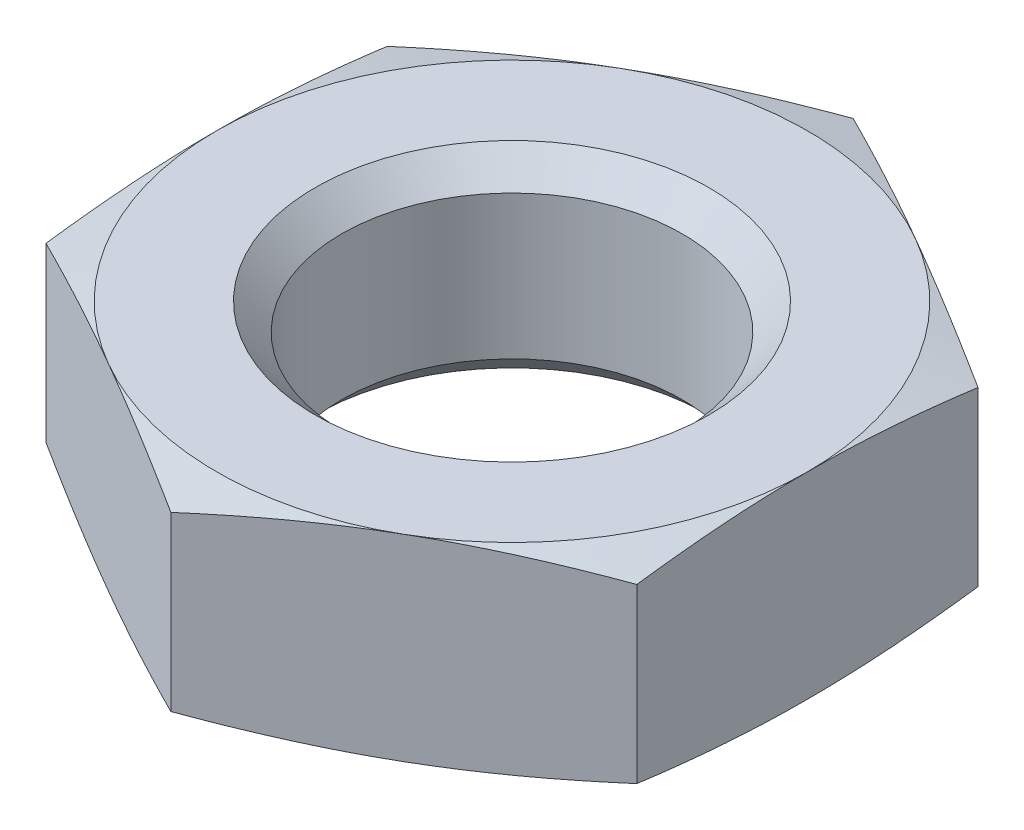
ISO-10303-21;
HEADER;
FILE_DESCRIPTION(('STEP AP214'),'2;1');
FILE_NAME('part.step','',(''),(''),'','','');
FILE_SCHEMA(('AUTOMOTIVE_DESIGN { 1 0 10303 214 1 1 1 1 }'));
ENDSEC;
DATA;
#1=APPLICATION_CONTEXT('core data for automotive mechanical design processes');
#2=APPLICATION_PROTOCOL_DEFINITION('international standard','automotive_design',2000,#1);
#3=PRODUCT_CONTEXT('',#1,'mechanical');
#4=PRODUCT('Part','Part','',(#3));
#5=PRODUCT_RELATED_PRODUCT_CATEGORY('part','',(#4));
#6=PRODUCT_DEFINITION_FORMATION('','',#4);
#7=PRODUCT_DEFINITION_CONTEXT('part definition',#1,'design');
#8=PRODUCT_DEFINITION('design','',#6,#7);
#9=PRODUCT_DEFINITION_SHAPE('','',#8);
#10=(LENGTH_UNIT() NAMED_UNIT(*) SI_UNIT(.MILLI.,.METRE.));
#11=(NAMED_UNIT(*) PLANE_ANGLE_UNIT() SI_UNIT($,.RADIAN.));
#12=(NAMED_UNIT(*) SI_UNIT($,.STERADIAN.) SOLID_ANGLE_UNIT());
#13=UNCERTAINTY_MEASURE_WITH_UNIT(LENGTH_MEASURE(1.E-05),#10,'distance_accuracy_value','');
#14=(GEOMETRIC_REPRESENTATION_CONTEXT(3) GLOBAL_UNCERTAINTY_ASSIGNED_CONTEXT((#13)) GLOBAL_UNIT_ASSIGNED_CONTEXT((#10,
#11,#12)) REPRESENTATION_CONTEXT('',''));
#15=CARTESIAN_POINT('',(0.,0.,0.));
#16=DIRECTION('',(0.,0.,1.));
#17=DIRECTION('',(1.,0.,0.));
#18=AXIS2_PLACEMENT_3D('',#15,#16,#17);
#19=CARTESIAN_POINT('',(0.,9.,0.));
#20=DIRECTION('',(0.,1.,0.));
#21=DIRECTION('',(-1.,0.,0.));
#22=AXIS2_PLACEMENT_3D('',#19,#20,#21);
#23=CONICAL_SURFACE('',#22,12.,1.30899693899575);
#24=CARTESIAN_POINT('',(5.99999999999998,9.,10.3923048454133));
#25=CARTESIAN_POINT('',(7.46976163509305,9.,9.5437375697477));
#26=CARTESIAN_POINT('',(9.,9.13129403163618,8.66025403784439));
#27=CARTESIAN_POINT('',(10.4219430908075,9.25329635848326,7.83929481159437));
#28=CARTESIAN_POINT('',(12.,9.49742261192844,6.92820323027551));
#29=B_SPLINE_CURVE_WITH_KNOTS('',2,(#24,#25,#26,#27,#28),.UNSPECIFIED.,.F.,.F.,(3,2,3),(0.,0.5,
1.),.UNSPECIFIED.);
#30=CARTESIAN_POINT('',(6.,9.,10.3923048454133));
#31=VERTEX_POINT('',#30);
#32=CARTESIAN_POINT('',(12.,9.49742261192856,6.92820323027551));
#33=VERTEX_POINT('',#32);
#34=EDGE_CURVE('E311',#31,#33,#29,.T.);
#35=ORIENTED_EDGE('',*,*,#34,.F.);
#36=CARTESIAN_POINT('',(0.,9.,0.));
#37=DIRECTION('',(0.,-1.,0.));
#38=DIRECTION('',(1.,0.,0.));
#39=AXIS2_PLACEMENT_3D('',#36,#37,#38);
#40=CIRCLE('',#39,12.);
#41=CARTESIAN_POINT('',(12.,9.,0.));
#42=VERTEX_POINT('',#41);
#43=EDGE_CURVE('E459',#42,#31,#40,.T.);
#44=ORIENTED_EDGE('',*,*,#43,.F.);
#45=CARTESIAN_POINT('',(12.,9.49742261192856,6.92820323027551));
#46=CARTESIAN_POINT('',(12.,9.25362781997351,5.10849412988159));
#47=CARTESIAN_POINT('',(12.,9.13154942779809,3.46753667956727));
#48=CARTESIAN_POINT('',(12.,9.,1.69927114311039));
#49=CARTESIAN_POINT('',(12.,9.,0.));
#50=B_SPLINE_CURVE_WITH_KNOTS('',2,(#45,#46,#47,#48,#49),.UNSPECIFIED.,.F.,.F.,(3,2,3),(0.,0.5,
1.),.UNSPECIFIED.);
#51=EDGE_CURVE('E629',#33,#42,#50,.T.);
#52=ORIENTED_EDGE('',*,*,#51,.F.);
#53=EDGE_LOOP('',(#35,#44,#52));
#54=FACE_BOUND('',#53,.T.);
#55=ADVANCED_FACE('F16',(#54),#23,.T.);
#56=CARTESIAN_POINT('',(0.,16.3569219381653,0.));
#57=DIRECTION('',(0.,-1.,0.));
#58=DIRECTION('',(1.,0.,0.));
#59=AXIS2_PLACEMENT_3D('',#56,#57,#58);
#60=CONICAL_SURFACE('',#59,14.4,1.30899693899575);
#61=CARTESIAN_POINT('',(0.,16.5025773880716,13.856406460551));
#62=CARTESIAN_POINT('',(-1.57753623074291,16.7466230922803,12.9456154930752));
#63=CARTESIAN_POINT('',(-2.99999999999999,16.8687059683638,12.1243556529821));
#64=CARTESIAN_POINT('',(-4.52978869038396,17.,11.2411317407857));
#65=CARTESIAN_POINT('',(-5.99999999999998,17.,10.3923048454133));
#66=B_SPLINE_CURVE_WITH_KNOTS('',2,(#61,#62,#63,#64,#65),.UNSPECIFIED.,.F.,.F.,(3,2,3),(0.,0.5,
1.),.UNSPECIFIED.);
#67=CARTESIAN_POINT('',(0.,16.5025773880715,13.856406460551));
#68=VERTEX_POINT('',#67);
#69=CARTESIAN_POINT('',(-6.,17.,10.3923048454133));
#70=VERTEX_POINT('',#69);
#71=EDGE_CURVE('E482',#68,#70,#66,.T.);
#72=ORIENTED_EDGE('',*,*,#71,.F.);
#73=CARTESIAN_POINT('',(5.99999999999998,17.,10.3923048454133));
#74=CARTESIAN_POINT('',(4.53023836506962,17.,11.2408721209849));
#75=CARTESIAN_POINT('',(3.,16.8687059683638,12.1243556529821));
#76=CARTESIAN_POINT('',(1.5780569093807,16.7467036415458,12.9453148791235));
#77=CARTESIAN_POINT('',(0.,16.5025773880716,13.856406460551));
#78=B_SPLINE_CURVE_WITH_KNOTS('',2,(#73,#74,#75,#76,#77),.UNSPECIFIED.,.F.,.F.,(3,2,3),(0.,0.5,
1.),.UNSPECIFIED.);
#79=CARTESIAN_POINT('',(6.,17.,10.3923048454133));
#80=VERTEX_POINT('',#79);
#81=EDGE_CURVE('E476',#80,#68,#78,.T.);
#82=ORIENTED_EDGE('',*,*,#81,.F.);
#83=CARTESIAN_POINT('',(0.,17.,0.));
#84=DIRECTION('',(0.,-1.,0.));
#85=DIRECTION('',(1.,0.,0.));
#86=AXIS2_PLACEMENT_3D('',#83,#84,#85);
#87=CIRCLE('',#86,12.);
#88=EDGE_CURVE('E358',#80,#70,#87,.T.);
#89=ORIENTED_EDGE('',*,*,#88,.T.);
#90=EDGE_LOOP('',(#72,#82,#89));
#91=FACE_BOUND('',#90,.T.);
#92=ADVANCED_FACE('F365',(#91),#60,.T.);
#93=CARTESIAN_POINT('',(0.,9.,0.));
#94=DIRECTION('',(0.,1.,0.));
#95=DIRECTION('',(-1.,0.,0.));
#96=AXIS2_PLACEMENT_3D('',#93,#94,#95);
#97=CONICAL_SURFACE('',#96,12.,1.30899693899575);
#98=CARTESIAN_POINT('',(12.,9.,0.));
#99=CARTESIAN_POINT('',(12.,9.,-1.69669351184597));
#100=CARTESIAN_POINT('',(12.,9.13122445860656,-3.46316531665232));
#101=CARTESIAN_POINT('',(12.,9.25322794160273,-5.10550939708846));
#102=CARTESIAN_POINT('',(12.,9.49742261192856,-6.92820323027551));
#103=B_SPLINE_CURVE_WITH_KNOTS('',2,(#98,#99,#100,#101,#102),.UNSPECIFIED.,.F.,.F.,(3,2,3),(0.,
0.5,1.),.UNSPECIFIED.);
#104=CARTESIAN_POINT('',(12.,9.49742261192856,-6.92820323027551));
#105=VERTEX_POINT('',#104);
#106=EDGE_CURVE('E124',#42,#105,#103,.T.);
#107=ORIENTED_EDGE('',*,*,#106,.F.);
#108=CARTESIAN_POINT('',(0.,9.,0.));
#109=DIRECTION('',(0.,-1.,0.));
#110=DIRECTION('',(1.,0.,0.));
#111=AXIS2_PLACEMENT_3D('',#108,#109,#110);
#112=CIRCLE('',#111,12.);
#113=CARTESIAN_POINT('',(6.,9.,-10.3923048454133));
#114=VERTEX_POINT('',#113);
#115=EDGE_CURVE('E528',#114,#42,#112,.T.);
#116=ORIENTED_EDGE('',*,*,#115,.F.);
#117=CARTESIAN_POINT('',(12.,9.49742261192844,-6.9282032302755));
#118=CARTESIAN_POINT('',(10.4224637691741,9.2533769077069,-7.83899419779923));
#119=CARTESIAN_POINT('',(8.99999999999998,9.13129403163618,-8.66025403784438));
#120=CARTESIAN_POINT('',(7.47021130954455,9.,-9.54347795008207));
#121=CARTESIAN_POINT('',(5.99999999999998,9.,-10.3923048454133));
#122=B_SPLINE_CURVE_WITH_KNOTS('',2,(#117,#118,#119,#120,#121),.UNSPECIFIED.,.F.,.F.,(3,2,3),
(0.,0.5,1.),.UNSPECIFIED.);
#123=EDGE_CURVE('E501',#105,#114,#122,.T.);
#124=ORIENTED_EDGE('',*,*,#123,.F.);
#125=EDGE_LOOP('',(#107,#116,#124));
#126=FACE_BOUND('',#125,.T.);
#127=ADVANCED_FACE('F373',(#126),#97,.T.);
#128=CARTESIAN_POINT('',(0.,16.3569219381653,0.));
#129=DIRECTION('',(0.,-1.,0.));
#130=DIRECTION('',(1.,0.,0.));
#131=AXIS2_PLACEMENT_3D('',#128,#129,#130);
#132=CONICAL_SURFACE('',#131,14.4,1.30899693899575);
#133=CARTESIAN_POINT('',(-5.99999999999998,17.,10.3923048454133));
#134=CARTESIAN_POINT('',(-7.46976163511963,17.,9.54373756973234));
#135=CARTESIAN_POINT('',(-9.,16.8687059683638,8.66025403784437));
#136=CARTESIAN_POINT('',(-10.4219430908384,16.746703641512,7.83929481157651));
#137=CARTESIAN_POINT('',(-12.,16.5025773880716,6.9282032302755));
#138=B_SPLINE_CURVE_WITH_KNOTS('',2,(#133,#134,#135,#136,#137),.UNSPECIFIED.,.F.,.F.,(3,2,3),
(0.,0.5,1.),.UNSPECIFIED.);
#139=CARTESIAN_POINT('',(-12.,16.5025773880715,6.92820323027551));
#140=VERTEX_POINT('',#139);
#141=EDGE_CURVE('E488',#70,#140,#138,.T.);
#142=ORIENTED_EDGE('',*,*,#141,.F.);
#143=CARTESIAN_POINT('',(0.,17.,0.));
#144=DIRECTION('',(0.,-1.,0.));
#145=DIRECTION('',(1.,0.,0.));
#146=AXIS2_PLACEMENT_3D('',#143,#144,#145);
#147=CIRCLE('',#146,12.);
#148=CARTESIAN_POINT('',(-12.,17.,0.));
#149=VERTEX_POINT('',#148);
#150=EDGE_CURVE('E573',#70,#149,#147,.T.);
#151=ORIENTED_EDGE('',*,*,#150,.T.);
#152=CARTESIAN_POINT('',(-12.,16.5025773880714,6.92820323027551));
#153=CARTESIAN_POINT('',(-12.,16.7463721800323,5.10849412983784));
#154=CARTESIAN_POINT('',(-12.,16.8684505722019,3.46753667956726));
#155=CARTESIAN_POINT('',(-12.,17.,1.69927114307261));
#156=CARTESIAN_POINT('',(-12.,17.,0.));
#157=B_SPLINE_CURVE_WITH_KNOTS('',2,(#152,#153,#154,#155,#156),.UNSPECIFIED.,.F.,.F.,(3,2,3),
(0.,0.5,1.),.UNSPECIFIED.);
#158=EDGE_CURVE('E578',#140,#149,#157,.T.);
#159=ORIENTED_EDGE('',*,*,#158,.F.);
#160=EDGE_LOOP('',(#142,#151,#159));
#161=FACE_BOUND('',#160,.T.);
#162=ADVANCED_FACE('F211',(#161),#132,.T.);
#163=CARTESIAN_POINT('',(0.,16.3569219381653,0.));
#164=DIRECTION('',(0.,-1.,0.));
#165=DIRECTION('',(1.,0.,0.));
#166=AXIS2_PLACEMENT_3D('',#163,#164,#165);
#167=CONICAL_SURFACE('',#166,14.4,1.30899693899575);
#168=CARTESIAN_POINT('',(12.,17.,0.));
#169=CARTESIAN_POINT('',(12.,17.,1.69875122165052));
#170=CARTESIAN_POINT('',(12.,16.8684505722019,3.46753667956727));
#171=CARTESIAN_POINT('',(12.,16.7464528411162,5.10789206731201));
#172=CARTESIAN_POINT('',(12.,16.5025773880714,6.92820323027551));
#173=B_SPLINE_CURVE_WITH_KNOTS('',2,(#168,#169,#170,#171,#172),.UNSPECIFIED.,.F.,.F.,(3,2,3),
(0.,0.5,1.),.UNSPECIFIED.);
#174=CARTESIAN_POINT('',(12.,17.,0.));
#175=VERTEX_POINT('',#174);
#176=CARTESIAN_POINT('',(12.,16.5025773880715,6.92820323027551));
#177=VERTEX_POINT('',#176);
#178=EDGE_CURVE('E193',#175,#177,#173,.T.);
#179=ORIENTED_EDGE('',*,*,#178,.F.);
#180=CARTESIAN_POINT('',(0.,17.,0.));
#181=DIRECTION('',(0.,-1.,0.));
#182=DIRECTION('',(1.,0.,0.));
#183=AXIS2_PLACEMENT_3D('',#180,#181,#182);
#184=CIRCLE('',#183,12.);
#185=EDGE_CURVE('E198',#175,#80,#184,.T.);
#186=ORIENTED_EDGE('',*,*,#185,.T.);
#187=CARTESIAN_POINT('',(12.,16.5025773880716,6.92820323027551));
#188=CARTESIAN_POINT('',(10.4224637693273,16.7466230922694,7.83899419771079));
#189=CARTESIAN_POINT('',(8.99999999999999,16.8687059683638,8.66025403784439));
#190=CARTESIAN_POINT('',(7.4702113096767,17.,9.54347795000579));
#191=CARTESIAN_POINT('',(5.99999999999998,17.,10.3923048454133));
#192=B_SPLINE_CURVE_WITH_KNOTS('',2,(#187,#188,#189,#190,#191),.UNSPECIFIED.,.F.,.F.,(3,2,3),
(0.,0.5,1.),.UNSPECIFIED.);
#193=EDGE_CURVE('E348',#177,#80,#192,.T.);
#194=ORIENTED_EDGE('',*,*,#193,.F.);
#195=EDGE_LOOP('',(#179,#186,#194));
#196=FACE_BOUND('',#195,.T.);
#197=ADVANCED_FACE('F200',(#196),#167,.T.);
#198=CARTESIAN_POINT('',(0.,17.,0.));
#199=DIRECTION('',(0.,1.,0.));
#200=DIRECTION('',(-1.,0.,0.));
#201=AXIS2_PLACEMENT_3D('',#198,#199,#200);
#202=CONICAL_SURFACE('',#201,8.,0.785398163397448);
#203=CARTESIAN_POINT('',(0.,15.9175,0.));
#204=DIRECTION('',(0.,-1.,0.));
#205=DIRECTION('',(1.,0.,0.));
#206=AXIS2_PLACEMENT_3D('',#203,#204,#205);
#207=CIRCLE('',#206,6.9175);
#208=CARTESIAN_POINT('',(6.9175,15.9175,0.));
#209=VERTEX_POINT('',#208);
#210=EDGE_CURVE('E27',#209,#209,#207,.T.);
#211=ORIENTED_EDGE('',*,*,#210,.T.);
#212=EDGE_LOOP('',(#211));
#213=FACE_BOUND('',#212,.T.);
#214=CARTESIAN_POINT('',(0.,17.,0.));
#215=DIRECTION('',(0.,-1.,0.));
#216=DIRECTION('',(1.,0.,0.));
#217=AXIS2_PLACEMENT_3D('',#214,#215,#216);
#218=CIRCLE('',#217,8.);
#219=CARTESIAN_POINT('',(8.,17.,0.));
#220=VERTEX_POINT('',#219);
#221=EDGE_CURVE('E574',#220,#220,#218,.T.);
#222=ORIENTED_EDGE('',*,*,#221,.F.);
#223=EDGE_LOOP('',(#222));
#224=FACE_BOUND('',#223,.T.);
#225=ADVANCED_FACE('F210',(#213,#224),#202,.F.);
#226=CARTESIAN_POINT('',(0.,10.0825,0.));
#227=DIRECTION('',(0.,-1.,0.));
#228=DIRECTION('',(1.,0.,0.));
#229=AXIS2_PLACEMENT_3D('',#226,#227,#228);
#230=CONICAL_SURFACE('',#229,6.9175,0.785398163397449);
#231=CARTESIAN_POINT('',(0.,10.0825,0.));
#232=DIRECTION('',(0.,-1.,0.));
#233=DIRECTION('',(1.,0.,0.));
#234=AXIS2_PLACEMENT_3D('',#231,#232,#233);
#235=CIRCLE('',#234,6.9175);
#236=CARTESIAN_POINT('',(6.9175,10.0825,0.));
#237=VERTEX_POINT('',#236);
#238=EDGE_CURVE('E11',#237,#237,#235,.T.);
#239=ORIENTED_EDGE('',*,*,#238,.F.);
#240=EDGE_LOOP('',(#239));
#241=FACE_BOUND('',#240,.T.);
#242=CARTESIAN_POINT('',(0.,9.,0.));
#243=DIRECTION('',(0.,-1.,0.));
#244=DIRECTION('',(1.,0.,0.));
#245=AXIS2_PLACEMENT_3D('',#242,#243,#244);
#246=CIRCLE('',#245,8.);
#247=CARTESIAN_POINT('',(8.,9.,0.));
#248=VERTEX_POINT('',#247);
#249=EDGE_CURVE('E531',#248,#248,#246,.T.);
#250=ORIENTED_EDGE('',*,*,#249,.T.);
#251=EDGE_LOOP('',(#250));
#252=FACE_BOUND('',#251,.T.);
#253=ADVANCED_FACE('F682',(#241,#252),#230,.F.);
#254=CARTESIAN_POINT('',(0.,9.,0.));
#255=DIRECTION('',(0.,1.,0.));
#256=DIRECTION('',(1.,0.,0.));
#257=AXIS2_PLACEMENT_3D('',#254,#255,#256);
#258=CYLINDRICAL_SURFACE('',#257,6.9175);
#259=ORIENTED_EDGE('',*,*,#238,.T.);
#260=EDGE_LOOP('',(#259));
#261=FACE_BOUND('',#260,.T.);
#262=ORIENTED_EDGE('',*,*,#210,.F.);
#263=EDGE_LOOP('',(#262));
#264=FACE_BOUND('',#263,.T.);
#265=ADVANCED_FACE('F325',(#261,#264),#258,.F.);
#266=CARTESIAN_POINT('',(0.,16.3569219381653,0.));
#267=DIRECTION('',(0.,-1.,0.));
#268=DIRECTION('',(1.,0.,0.));
#269=AXIS2_PLACEMENT_3D('',#266,#267,#268);
#270=CONICAL_SURFACE('',#269,14.4,1.30899693899575);
#271=CARTESIAN_POINT('',(0.,16.5025773880716,-13.856406460551));
#272=CARTESIAN_POINT('',(1.57753623074291,16.7466230922803,-12.9456154930752));
#273=CARTESIAN_POINT('',(2.99999999999999,16.8687059683638,-12.1243556529821));
#274=CARTESIAN_POINT('',(4.52978869038396,17.,-11.2411317407857));
#275=CARTESIAN_POINT('',(5.99999999999998,17.,-10.3923048454133));
#276=B_SPLINE_CURVE_WITH_KNOTS('',2,(#271,#272,#273,#274,#275),.UNSPECIFIED.,.F.,.F.,(3,2,3),
(0.,0.5,1.),.UNSPECIFIED.);
#277=CARTESIAN_POINT('',(0.,16.5025773880715,-13.856406460551));
#278=VERTEX_POINT('',#277);
#279=CARTESIAN_POINT('',(6.,17.,-10.3923048454133));
#280=VERTEX_POINT('',#279);
#281=EDGE_CURVE('E136',#278,#280,#276,.T.);
#282=ORIENTED_EDGE('',*,*,#281,.F.);
#283=CARTESIAN_POINT('',(-5.99999999999998,17.,-10.3923048454133));
#284=CARTESIAN_POINT('',(-4.53023836506962,17.,-11.2408721209849));
#285=CARTESIAN_POINT('',(-3.,16.8687059683638,-12.1243556529821));
#286=CARTESIAN_POINT('',(-1.5780569093807,16.7467036415458,-12.9453148791235));
#287=CARTESIAN_POINT('',(0.,16.5025773880716,-13.856406460551));
#288=B_SPLINE_CURVE_WITH_KNOTS('',2,(#283,#284,#285,#286,#287),.UNSPECIFIED.,.F.,.F.,(3,2,3),
(0.,0.5,1.),.UNSPECIFIED.);
#289=CARTESIAN_POINT('',(-6.,17.,-10.3923048454133));
#290=VERTEX_POINT('',#289);
#291=EDGE_CURVE('E361',#290,#278,#288,.T.);
#292=ORIENTED_EDGE('',*,*,#291,.F.);
#293=CARTESIAN_POINT('',(0.,17.,0.));
#294=DIRECTION('',(0.,-1.,0.));
#295=DIRECTION('',(1.,0.,0.));
#296=AXIS2_PLACEMENT_3D('',#293,#294,#295);
#297=CIRCLE('',#296,12.);
#298=EDGE_CURVE('E567',#290,#280,#297,.T.);
#299=ORIENTED_EDGE('',*,*,#298,.T.);
#300=EDGE_LOOP('',(#282,#292,#299));
#301=FACE_BOUND('',#300,.T.);
#302=ADVANCED_FACE('F554',(#301),#270,.T.);
#303=CARTESIAN_POINT('',(0.,17.,12.));
#304=DIRECTION('',(0.,1.,0.));
#305=DIRECTION('',(-1.,0.,0.));
#306=AXIS2_PLACEMENT_3D('',#303,#304,#305);
#307=PLANE('',#306);
#308=ORIENTED_EDGE('',*,*,#221,.T.);
#309=EDGE_LOOP('',(#308));
#310=FACE_BOUND('',#309,.T.);
#311=ORIENTED_EDGE('',*,*,#88,.F.);
#312=ORIENTED_EDGE('',*,*,#185,.F.);
#313=CARTESIAN_POINT('',(0.,17.,0.));
#314=DIRECTION('',(0.,-1.,0.));
#315=DIRECTION('',(1.,0.,0.));
#316=AXIS2_PLACEMENT_3D('',#313,#314,#315);
#317=CIRCLE('',#316,12.);
#318=EDGE_CURVE('E142',#280,#175,#317,.T.);
#319=ORIENTED_EDGE('',*,*,#318,.F.);
#320=ORIENTED_EDGE('',*,*,#298,.F.);
#321=CARTESIAN_POINT('',(0.,17.,0.));
#322=DIRECTION('',(0.,-1.,0.));
#323=DIRECTION('',(1.,0.,0.));
#324=AXIS2_PLACEMENT_3D('',#321,#322,#323);
#325=CIRCLE('',#324,12.);
#326=EDGE_CURVE('E489',#149,#290,#325,.T.);
#327=ORIENTED_EDGE('',*,*,#326,.F.);
#328=ORIENTED_EDGE('',*,*,#150,.F.);
#329=EDGE_LOOP('',(#311,#312,#319,#320,#327,#328));
#330=FACE_BOUND('',#329,.T.);
#331=ADVANCED_FACE('F430',(#310,#330),#307,.T.);
#332=CARTESIAN_POINT('',(-12.,9.,-6.92820323027551));
#333=DIRECTION('',(0.5,0.,0.866025403784439));
#334=DIRECTION('',(0.,1.,0.));
#335=AXIS2_PLACEMENT_3D('',#332,#333,#334);
#336=PLANE('',#335);
#337=CARTESIAN_POINT('',(-12.,16.5025773880716,-6.92820323027551));
#338=CARTESIAN_POINT('',(-10.4224637693273,16.7466230922694,-7.83899419771079));
#339=CARTESIAN_POINT('',(-8.99999999999999,16.8687059683638,-8.66025403784439));
#340=CARTESIAN_POINT('',(-7.4702113096767,17.,-9.54347795000579));
#341=CARTESIAN_POINT('',(-5.99999999999998,17.,-10.3923048454133));
#342=B_SPLINE_CURVE_WITH_KNOTS('',2,(#337,#338,#339,#340,#341),.UNSPECIFIED.,.F.,.F.,(3,2,3),
(0.,0.5,1.),.UNSPECIFIED.);
#343=CARTESIAN_POINT('',(-12.,16.5025773880715,-6.92820323027551));
#344=VERTEX_POINT('',#343);
#345=EDGE_CURVE('E416',#344,#290,#342,.T.);
#346=ORIENTED_EDGE('',*,*,#345,.T.);
#347=ORIENTED_EDGE('',*,*,#291,.T.);
#348=DIRECTION('',(0.,1.,0.));
#349=VECTOR('',#348,1.);
#350=CARTESIAN_POINT('',(0.,9.,-13.856406460551));
#351=LINE('',#350,#349);
#352=CARTESIAN_POINT('',(0.,9.49742261192856,-13.856406460551));
#353=VERTEX_POINT('',#352);
#354=EDGE_CURVE('E499',#353,#278,#351,.T.);
#355=ORIENTED_EDGE('',*,*,#354,.F.);
#356=CARTESIAN_POINT('',(0.,9.49742261192844,-13.856406460551));
#357=CARTESIAN_POINT('',(-1.57753623074158,9.25337690771994,-12.945615493076));
#358=CARTESIAN_POINT('',(-3.,9.13129403163618,-12.1243556529821));
#359=CARTESIAN_POINT('',(-4.52978869038262,9.,-11.2411317407865));
#360=CARTESIAN_POINT('',(-5.99999999999998,9.,-10.3923048454133));
#361=B_SPLINE_CURVE_WITH_KNOTS('',2,(#356,#357,#358,#359,#360),.UNSPECIFIED.,.F.,.F.,(3,2,3),
(0.,0.5,1.),.UNSPECIFIED.);
#362=CARTESIAN_POINT('',(-6.,9.,-10.3923048454133));
#363=VERTEX_POINT('',#362);
#364=EDGE_CURVE('E581',#353,#363,#361,.T.);
#365=ORIENTED_EDGE('',*,*,#364,.T.);
#366=CARTESIAN_POINT('',(-5.99999999999998,9.,-10.3923048454133));
#367=CARTESIAN_POINT('',(-7.46976163509305,9.,-9.5437375697477));
#368=CARTESIAN_POINT('',(-9.,9.13129403163618,-8.66025403784439));
#369=CARTESIAN_POINT('',(-10.4219430908075,9.25329635848326,-7.83929481159437));
#370=CARTESIAN_POINT('',(-12.,9.49742261192844,-6.92820323027551));
#371=B_SPLINE_CURVE_WITH_KNOTS('',2,(#366,#367,#368,#369,#370),.UNSPECIFIED.,.F.,.F.,(3,2,3),
(0.,0.5,1.),.UNSPECIFIED.);
#372=CARTESIAN_POINT('',(-12.,9.49742261192856,-6.92820323027551));
#373=VERTEX_POINT('',#372);
#374=EDGE_CURVE('E454',#363,#373,#371,.T.);
#375=ORIENTED_EDGE('',*,*,#374,.T.);
#376=DIRECTION('',(0.,1.,0.));
#377=VECTOR('',#376,1.);
#378=CARTESIAN_POINT('',(-12.,9.,-6.92820323027551));
#379=LINE('',#378,#377);
#380=EDGE_CURVE('E278',#373,#344,#379,.T.);
#381=ORIENTED_EDGE('',*,*,#380,.T.);
#382=EDGE_LOOP('',(#346,#347,#355,#365,#375,#381));
#383=FACE_BOUND('',#382,.T.);
#384=ADVANCED_FACE('F421',(#383),#336,.F.);
#385=CARTESIAN_POINT('',(0.,9.,-13.856406460551));
#386=DIRECTION('',(-0.5,0.,0.866025403784439));
#387=DIRECTION('',(0.,-1.,0.));
#388=AXIS2_PLACEMENT_3D('',#385,#386,#387);
#389=PLANE('',#388);
#390=ORIENTED_EDGE('',*,*,#281,.T.);
#391=CARTESIAN_POINT('',(5.99999999999998,17.,-10.3923048454133));
#392=CARTESIAN_POINT('',(7.46976163511963,17.,-9.54373756973234));
#393=CARTESIAN_POINT('',(9.,16.8687059683638,-8.66025403784437));
#394=CARTESIAN_POINT('',(10.4219430908384,16.7467036415119,-7.83929481157651));
#395=CARTESIAN_POINT('',(12.,16.5025773880716,-6.9282032302755));
#396=B_SPLINE_CURVE_WITH_KNOTS('',2,(#391,#392,#393,#394,#395),.UNSPECIFIED.,.F.,.F.,(3,2,3),
(0.,0.5,1.),.UNSPECIFIED.);
#397=CARTESIAN_POINT('',(12.,16.5025773880715,-6.92820323027551));
#398=VERTEX_POINT('',#397);
#399=EDGE_CURVE('E131',#280,#398,#396,.T.);
#400=ORIENTED_EDGE('',*,*,#399,.T.);
#401=DIRECTION('',(0.,1.,0.));
#402=VECTOR('',#401,1.);
#403=CARTESIAN_POINT('',(12.,9.,-6.92820323027551));
#404=LINE('',#403,#402);
#405=EDGE_CURVE('E117',#105,#398,#404,.T.);
#406=ORIENTED_EDGE('',*,*,#405,.F.);
#407=ORIENTED_EDGE('',*,*,#123,.T.);
#408=CARTESIAN_POINT('',(5.99999999999998,9.,-10.3923048454133));
#409=CARTESIAN_POINT('',(4.53023836497489,9.,-11.2408721210396));
#410=CARTESIAN_POINT('',(2.99999999999998,9.13129403163618,-12.1243556529821));
#411=CARTESIAN_POINT('',(1.57805690927119,9.25329635847109,-12.9453148791867));
#412=CARTESIAN_POINT('',(0.,9.49742261192844,-13.856406460551));
#413=B_SPLINE_CURVE_WITH_KNOTS('',2,(#408,#409,#410,#411,#412),.UNSPECIFIED.,.F.,.F.,(3,2,3),
(0.,0.5,1.),.UNSPECIFIED.);
#414=EDGE_CURVE('E127',#114,#353,#413,.T.);
#415=ORIENTED_EDGE('',*,*,#414,.T.);
#416=ORIENTED_EDGE('',*,*,#354,.T.);
#417=EDGE_LOOP('',(#390,#400,#406,#407,#415,#416));
#418=FACE_BOUND('',#417,.T.);
#419=ADVANCED_FACE('F133',(#418),#389,.F.);
#420=CARTESIAN_POINT('',(-12.,9.,6.92820323027551));
#421=DIRECTION('',(1.,0.,0.));
#422=DIRECTION('',(0.,0.,-1.));
#423=AXIS2_PLACEMENT_3D('',#420,#421,#422);
#424=PLANE('',#423);
#425=ORIENTED_EDGE('',*,*,#158,.T.);
#426=CARTESIAN_POINT('',(-12.,17.,0.));
#427=CARTESIAN_POINT('',(-12.,17.,-1.69669351195864));
#428=CARTESIAN_POINT('',(-12.,16.8687755413934,-3.46316531665233));
#429=CARTESIAN_POINT('',(-12.,16.7467720583798,-5.10550939721889));
#430=CARTESIAN_POINT('',(-12.,16.5025773880714,-6.92820323027551));
#431=B_SPLINE_CURVE_WITH_KNOTS('',2,(#426,#427,#428,#429,#430),.UNSPECIFIED.,.F.,.F.,(3,2,3),
(0.,0.5,1.),.UNSPECIFIED.);
#432=EDGE_CURVE('E392',#149,#344,#431,.T.);
#433=ORIENTED_EDGE('',*,*,#432,.T.);
#434=ORIENTED_EDGE('',*,*,#380,.F.);
#435=CARTESIAN_POINT('',(-12.,9.49742261192856,-6.92820323027551));
#436=CARTESIAN_POINT('',(-12.,9.25330874755539,-5.10611254093021));
#437=CARTESIAN_POINT('',(-12.,9.13122445860656,-3.46316531665231));
#438=CARTESIAN_POINT('',(-12.,9.,-1.69721441599738));
#439=CARTESIAN_POINT('',(-12.,9.,0.));
#440=B_SPLINE_CURVE_WITH_KNOTS('',2,(#435,#436,#437,#438,#439),.UNSPECIFIED.,.F.,.F.,(3,2,3),
(0.,0.5,1.),.UNSPECIFIED.);
#441=CARTESIAN_POINT('',(-12.,9.,0.));
#442=VERTEX_POINT('',#441);
#443=EDGE_CURVE('E272',#373,#442,#440,.T.);
#444=ORIENTED_EDGE('',*,*,#443,.T.);
#445=CARTESIAN_POINT('',(-12.,9.,0.));
#446=CARTESIAN_POINT('',(-12.,9.,1.6987512215757));
#447=CARTESIAN_POINT('',(-12.,9.13154942779809,3.46753667956726));
#448=CARTESIAN_POINT('',(-12.,9.25354715887225,5.10789206722541));
#449=CARTESIAN_POINT('',(-12.,9.49742261192856,6.92820323027551));
#450=B_SPLINE_CURVE_WITH_KNOTS('',2,(#445,#446,#447,#448,#449),.UNSPECIFIED.,.F.,.F.,(3,2,3),
(0.,0.5,1.),.UNSPECIFIED.);
#451=CARTESIAN_POINT('',(-12.,9.49742261192856,6.92820323027551));
#452=VERTEX_POINT('',#451);
#453=EDGE_CURVE('E231',#442,#452,#450,.T.);
#454=ORIENTED_EDGE('',*,*,#453,.T.);
#455=DIRECTION('',(0.,1.,0.));
#456=VECTOR('',#455,1.);
#457=CARTESIAN_POINT('',(-12.,9.,6.92820323027551));
#458=LINE('',#457,#456);
#459=EDGE_CURVE('E490',#452,#140,#458,.T.);
#460=ORIENTED_EDGE('',*,*,#459,.T.);
#461=EDGE_LOOP('',(#425,#433,#434,#444,#454,#460));
#462=FACE_BOUND('',#461,.T.);
#463=ADVANCED_FACE('F238',(#462),#424,.F.);
#464=CARTESIAN_POINT('',(0.,9.,0.));
#465=DIRECTION('',(0.,1.,0.));
#466=DIRECTION('',(-1.,0.,0.));
#467=AXIS2_PLACEMENT_3D('',#464,#465,#466);
#468=CONICAL_SURFACE('',#467,12.,1.30899693899575);
#469=ORIENTED_EDGE('',*,*,#414,.F.);
#470=CARTESIAN_POINT('',(0.,9.,0.));
#471=DIRECTION('',(0.,-1.,0.));
#472=DIRECTION('',(1.,0.,0.));
#473=AXIS2_PLACEMENT_3D('',#470,#471,#472);
#474=CIRCLE('',#473,12.);
#475=EDGE_CURVE('E532',#363,#114,#474,.T.);
#476=ORIENTED_EDGE('',*,*,#475,.F.);
#477=ORIENTED_EDGE('',*,*,#364,.F.);
#478=EDGE_LOOP('',(#469,#476,#477));
#479=FACE_BOUND('',#478,.T.);
#480=ADVANCED_FACE('F161',(#479),#468,.T.);
#481=CARTESIAN_POINT('',(12.,9.,-6.92820323027551));
#482=DIRECTION('',(-1.,0.,0.));
#483=DIRECTION('',(0.,-1.,0.));
#484=AXIS2_PLACEMENT_3D('',#481,#482,#483);
#485=PLANE('',#484);
#486=CARTESIAN_POINT('',(12.,16.5025773880714,-6.92820323027551));
#487=CARTESIAN_POINT('',(12.,16.7466912524735,-5.10611254071462));
#488=CARTESIAN_POINT('',(12.,16.8687755413934,-3.46316531665232));
#489=CARTESIAN_POINT('',(12.,17.,-1.69721441581121));
#490=CARTESIAN_POINT('',(12.,17.,0.));
#491=B_SPLINE_CURVE_WITH_KNOTS('',2,(#486,#487,#488,#489,#490),.UNSPECIFIED.,.F.,.F.,(3,2,3),
(0.,0.5,1.),.UNSPECIFIED.);
#492=EDGE_CURVE('E121',#398,#175,#491,.T.);
#493=ORIENTED_EDGE('',*,*,#492,.T.);
#494=ORIENTED_EDGE('',*,*,#178,.T.);
#495=DIRECTION('',(0.,1.,0.));
#496=VECTOR('',#495,1.);
#497=CARTESIAN_POINT('',(12.,9.,6.92820323027551));
#498=LINE('',#497,#496);
#499=EDGE_CURVE('E615',#33,#177,#498,.T.);
#500=ORIENTED_EDGE('',*,*,#499,.F.);
#501=ORIENTED_EDGE('',*,*,#51,.T.);
#502=ORIENTED_EDGE('',*,*,#106,.T.);
#503=ORIENTED_EDGE('',*,*,#405,.T.);
#504=EDGE_LOOP('',(#493,#494,#500,#501,#502,#503));
#505=FACE_BOUND('',#504,.T.);
#506=ADVANCED_FACE('F119',(#505),#485,.F.);
#507=CARTESIAN_POINT('',(0.,9.,0.));
#508=DIRECTION('',(0.,1.,0.));
#509=DIRECTION('',(-1.,0.,0.));
#510=AXIS2_PLACEMENT_3D('',#507,#508,#509);
#511=CONICAL_SURFACE('',#510,12.,1.30899693899575);
#512=ORIENTED_EDGE('',*,*,#374,.F.);
#513=CARTESIAN_POINT('',(0.,9.,0.));
#514=DIRECTION('',(0.,-1.,0.));
#515=DIRECTION('',(1.,0.,0.));
#516=AXIS2_PLACEMENT_3D('',#513,#514,#515);
#517=CIRCLE('',#516,12.);
#518=EDGE_CURVE('E465',#442,#363,#517,.T.);
#519=ORIENTED_EDGE('',*,*,#518,.F.);
#520=ORIENTED_EDGE('',*,*,#443,.F.);
#521=EDGE_LOOP('',(#512,#519,#520));
#522=FACE_BOUND('',#521,.T.);
#523=ADVANCED_FACE('F160',(#522),#511,.T.);
#524=CARTESIAN_POINT('',(12.,9.,6.92820323027551));
#525=DIRECTION('',(-0.5,0.,-0.866025403784439));
#526=DIRECTION('',(0.,1.,0.));
#527=AXIS2_PLACEMENT_3D('',#524,#525,#526);
#528=PLANE('',#527);
#529=ORIENTED_EDGE('',*,*,#193,.T.);
#530=ORIENTED_EDGE('',*,*,#81,.T.);
#531=DIRECTION('',(0.,1.,0.));
#532=VECTOR('',#531,1.);
#533=CARTESIAN_POINT('',(0.,9.,13.856406460551));
#534=LINE('',#533,#532);
#535=CARTESIAN_POINT('',(0.,9.49742261192856,13.856406460551));
#536=VERTEX_POINT('',#535);
#537=EDGE_CURVE('E351',#536,#68,#534,.T.);
#538=ORIENTED_EDGE('',*,*,#537,.F.);
#539=CARTESIAN_POINT('',(0.,9.49742261192844,13.856406460551));
#540=CARTESIAN_POINT('',(1.57753623074158,9.25337690771994,12.945615493076));
#541=CARTESIAN_POINT('',(3.,9.13129403163618,12.1243556529821));
#542=CARTESIAN_POINT('',(4.52978869038262,9.,11.2411317407865));
#543=CARTESIAN_POINT('',(5.99999999999998,9.,10.3923048454133));
#544=B_SPLINE_CURVE_WITH_KNOTS('',2,(#539,#540,#541,#542,#543),.UNSPECIFIED.,.F.,.F.,(3,2,3),
(0.,0.5,1.),.UNSPECIFIED.);
#545=EDGE_CURVE('E354',#536,#31,#544,.T.);
#546=ORIENTED_EDGE('',*,*,#545,.T.);
#547=ORIENTED_EDGE('',*,*,#34,.T.);
#548=ORIENTED_EDGE('',*,*,#499,.T.);
#549=EDGE_LOOP('',(#529,#530,#538,#546,#547,#548));
#550=FACE_BOUND('',#549,.T.);
#551=ADVANCED_FACE('F288',(#550),#528,.F.);
#552=CARTESIAN_POINT('',(0.,9.,8.));
#553=DIRECTION('',(0.,-1.,0.));
#554=DIRECTION('',(0.,0.,1.));
#555=AXIS2_PLACEMENT_3D('',#552,#553,#554);
#556=PLANE('',#555);
#557=ORIENTED_EDGE('',*,*,#249,.F.);
#558=EDGE_LOOP('',(#557));
#559=FACE_BOUND('',#558,.T.);
#560=ORIENTED_EDGE('',*,*,#43,.T.);
#561=CARTESIAN_POINT('',(0.,9.,0.));
#562=DIRECTION('',(0.,-1.,0.));
#563=DIRECTION('',(1.,0.,0.));
#564=AXIS2_PLACEMENT_3D('',#561,#562,#563);
#565=CIRCLE('',#564,12.);
#566=CARTESIAN_POINT('',(-6.,9.,10.3923048454133));
#567=VERTEX_POINT('',#566);
#568=EDGE_CURVE('E467',#31,#567,#565,.T.);
#569=ORIENTED_EDGE('',*,*,#568,.T.);
#570=CARTESIAN_POINT('',(0.,9.,0.));
#571=DIRECTION('',(0.,-1.,0.));
#572=DIRECTION('',(1.,0.,0.));
#573=AXIS2_PLACEMENT_3D('',#570,#571,#572);
#574=CIRCLE('',#573,12.);
#575=EDGE_CURVE('E457',#567,#442,#574,.T.);
#576=ORIENTED_EDGE('',*,*,#575,.T.);
#577=ORIENTED_EDGE('',*,*,#518,.T.);
#578=ORIENTED_EDGE('',*,*,#475,.T.);
#579=ORIENTED_EDGE('',*,*,#115,.T.);
#580=EDGE_LOOP('',(#560,#569,#576,#577,#578,#579));
#581=FACE_BOUND('',#580,.T.);
#582=ADVANCED_FACE('F164',(#559,#581),#556,.T.);
#583=CARTESIAN_POINT('',(0.,9.,0.));
#584=DIRECTION('',(0.,1.,0.));
#585=DIRECTION('',(-1.,0.,0.));
#586=AXIS2_PLACEMENT_3D('',#583,#584,#585);
#587=CONICAL_SURFACE('',#586,12.,1.30899693899575);
#588=CARTESIAN_POINT('',(-12.,9.49742261192844,6.9282032302755));
#589=CARTESIAN_POINT('',(-10.4224637691741,9.2533769077069,7.83899419779923));
#590=CARTESIAN_POINT('',(-8.99999999999998,9.13129403163618,8.66025403784438));
#591=CARTESIAN_POINT('',(-7.47021130954455,9.,9.54347795008207));
#592=CARTESIAN_POINT('',(-5.99999999999998,9.,10.3923048454133));
#593=B_SPLINE_CURVE_WITH_KNOTS('',2,(#588,#589,#590,#591,#592),.UNSPECIFIED.,.F.,.F.,(3,2,3),
(0.,0.5,1.),.UNSPECIFIED.);
#594=EDGE_CURVE('E836',#452,#567,#593,.T.);
#595=ORIENTED_EDGE('',*,*,#594,.F.);
#596=ORIENTED_EDGE('',*,*,#453,.F.);
#597=ORIENTED_EDGE('',*,*,#575,.F.);
#598=EDGE_LOOP('',(#595,#596,#597));
#599=FACE_BOUND('',#598,.T.);
#600=ADVANCED_FACE('F292',(#599),#587,.T.);
#601=CARTESIAN_POINT('',(0.,9.,0.));
#602=DIRECTION('',(0.,1.,0.));
#603=DIRECTION('',(-1.,0.,0.));
#604=AXIS2_PLACEMENT_3D('',#601,#602,#603);
#605=CONICAL_SURFACE('',#604,12.,1.30899693899575);
#606=ORIENTED_EDGE('',*,*,#545,.F.);
#607=CARTESIAN_POINT('',(-5.99999999999998,9.,10.3923048454133));
#608=CARTESIAN_POINT('',(-4.53023836497489,9.,11.2408721210396));
#609=CARTESIAN_POINT('',(-2.99999999999998,9.13129403163618,12.1243556529821));
#610=CARTESIAN_POINT('',(-1.5780569092712,9.25329635847109,12.9453148791867));
#611=CARTESIAN_POINT('',(0.,9.49742261192844,13.856406460551));
#612=B_SPLINE_CURVE_WITH_KNOTS('',2,(#607,#608,#609,#610,#611),.UNSPECIFIED.,.F.,.F.,(3,2,3),
(0.,0.5,1.),.UNSPECIFIED.);
#613=EDGE_CURVE('E355',#567,#536,#612,.T.);
#614=ORIENTED_EDGE('',*,*,#613,.F.);
#615=ORIENTED_EDGE('',*,*,#568,.F.);
#616=EDGE_LOOP('',(#606,#614,#615));
#617=FACE_BOUND('',#616,.T.);
#618=ADVANCED_FACE('F289',(#617),#605,.T.);
#619=CARTESIAN_POINT('',(0.,9.,13.856406460551));
#620=DIRECTION('',(0.5,0.,-0.866025403784439));
#621=DIRECTION('',(0.866025403784439,0.,0.5));
#622=AXIS2_PLACEMENT_3D('',#619,#620,#621);
#623=PLANE('',#622);
#624=ORIENTED_EDGE('',*,*,#71,.T.);
#625=ORIENTED_EDGE('',*,*,#141,.T.);
#626=ORIENTED_EDGE('',*,*,#459,.F.);
#627=ORIENTED_EDGE('',*,*,#594,.T.);
#628=ORIENTED_EDGE('',*,*,#613,.T.);
#629=ORIENTED_EDGE('',*,*,#537,.T.);
#630=EDGE_LOOP('',(#624,#625,#626,#627,#628,#629));
#631=FACE_BOUND('',#630,.T.);
#632=ADVANCED_FACE('F480',(#631),#623,.F.);
#633=CARTESIAN_POINT('',(0.,16.3569219381653,0.));
#634=DIRECTION('',(0.,-1.,0.));
#635=DIRECTION('',(1.,0.,0.));
#636=AXIS2_PLACEMENT_3D('',#633,#634,#635);
#637=CONICAL_SURFACE('',#636,14.4,1.30899693899575);
#638=ORIENTED_EDGE('',*,*,#345,.F.);
#639=ORIENTED_EDGE('',*,*,#432,.F.);
#640=ORIENTED_EDGE('',*,*,#326,.T.);
#641=EDGE_LOOP('',(#638,#639,#640));
#642=FACE_BOUND('',#641,.T.);
#643=ADVANCED_FACE('F326',(#642),#637,.T.);
#644=CARTESIAN_POINT('',(0.,16.3569219381653,0.));
#645=DIRECTION('',(0.,-1.,0.));
#646=DIRECTION('',(1.,0.,0.));
#647=AXIS2_PLACEMENT_3D('',#644,#645,#646);
#648=CONICAL_SURFACE('',#647,14.4,1.30899693899575);
#649=ORIENTED_EDGE('',*,*,#492,.F.);
#650=ORIENTED_EDGE('',*,*,#399,.F.);
#651=ORIENTED_EDGE('',*,*,#318,.T.);
#652=EDGE_LOOP('',(#649,#650,#651));
#653=FACE_BOUND('',#652,.T.);
#654=ADVANCED_FACE('F145',(#653),#648,.T.);
#655=CLOSED_SHELL('',(#55,#92,#127,#162,#197,#225,#253,#265,#302,#331,#384,#419,#463,#480,#506,
#523,#551,#582,#600,#618,#632,#643,#654));
#656=MANIFOLD_SOLID_BREP('B1',#655);
#657=ADVANCED_BREP_SHAPE_REPRESENTATION('',(#18,#656),#14);
#658=SHAPE_DEFINITION_REPRESENTATION(#9,#657);
ENDSEC;
END-ISO-10303-21;
